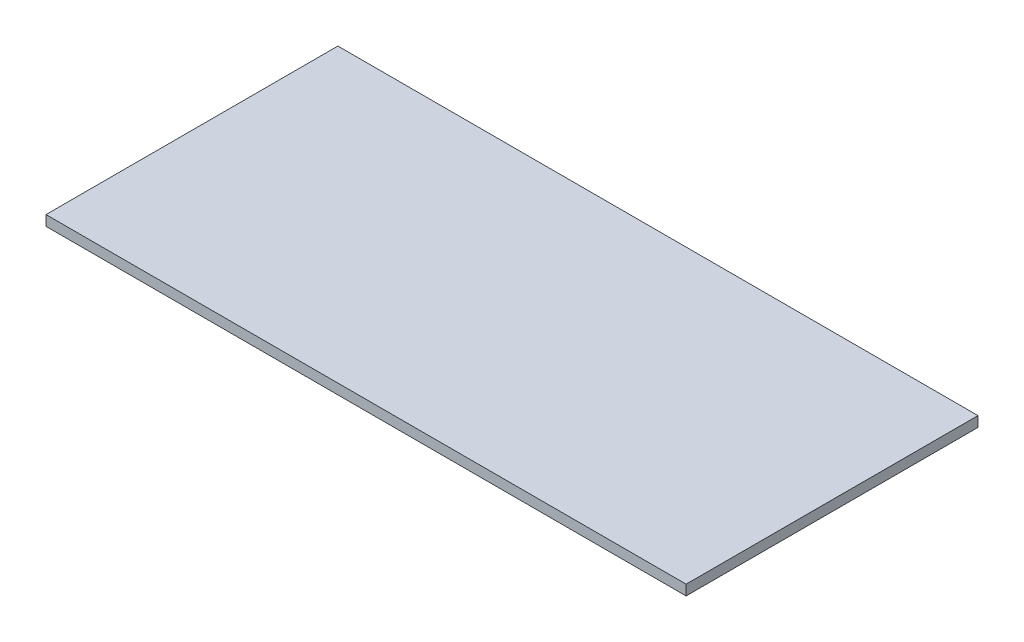
ISO-10303-21;
HEADER;
FILE_DESCRIPTION(('STEP AP214'),'2;1');
FILE_NAME('part.step','',(''),(''),'','','');
FILE_SCHEMA(('AUTOMOTIVE_DESIGN { 1 0 10303 214 1 1 1 1 }'));
ENDSEC;
DATA;
#1=APPLICATION_CONTEXT('core data for automotive mechanical design processes');
#2=APPLICATION_PROTOCOL_DEFINITION('international standard','automotive_design',2000,#1);
#3=PRODUCT_CONTEXT('',#1,'mechanical');
#4=PRODUCT('Part','Part','',(#3));
#5=PRODUCT_RELATED_PRODUCT_CATEGORY('part','',(#4));
#6=PRODUCT_DEFINITION_FORMATION('','',#4);
#7=PRODUCT_DEFINITION_CONTEXT('part definition',#1,'design');
#8=PRODUCT_DEFINITION('design','',#6,#7);
#9=PRODUCT_DEFINITION_SHAPE('','',#8);
#10=(LENGTH_UNIT() NAMED_UNIT(*) SI_UNIT(.MILLI.,.METRE.));
#11=(NAMED_UNIT(*) PLANE_ANGLE_UNIT() SI_UNIT($,.RADIAN.));
#12=(NAMED_UNIT(*) SI_UNIT($,.STERADIAN.) SOLID_ANGLE_UNIT());
#13=UNCERTAINTY_MEASURE_WITH_UNIT(LENGTH_MEASURE(1.E-05),#10,'distance_accuracy_value','');
#14=(GEOMETRIC_REPRESENTATION_CONTEXT(3) GLOBAL_UNCERTAINTY_ASSIGNED_CONTEXT((#13)) GLOBAL_UNIT_ASSIGNED_CONTEXT((#10,
#11,#12)) REPRESENTATION_CONTEXT('',''));
#15=CARTESIAN_POINT('',(0.,0.,0.));
#16=DIRECTION('',(0.,0.,1.));
#17=DIRECTION('',(1.,0.,0.));
#18=AXIS2_PLACEMENT_3D('',#15,#16,#17);
#19=CARTESIAN_POINT('',(-128.271186440678,4.,-50.7203389830509));
#20=DIRECTION('',(1.,0.,0.));
#21=DIRECTION('',(0.,0.,-1.));
#22=AXIS2_PLACEMENT_3D('',#19,#20,#21);
#23=PLANE('',#22);
#24=DIRECTION('',(0.,0.,1.));
#25=VECTOR('',#24,1.);
#26=CARTESIAN_POINT('',(-128.271186440678,0.,-50.7203389830509));
#27=LINE('',#26,#25);
#28=CARTESIAN_POINT('',(-128.271186440678,0.,-50.7203389830509));
#29=VERTEX_POINT('',#28);
#30=CARTESIAN_POINT('',(-128.271186440678,0.,63.2796610169491));
#31=VERTEX_POINT('',#30);
#32=EDGE_CURVE('E95',#29,#31,#27,.T.);
#33=ORIENTED_EDGE('',*,*,#32,.T.);
#34=DIRECTION('',(0.,-1.,0.));
#35=VECTOR('',#34,1.);
#36=CARTESIAN_POINT('',(-128.271186440678,4.,63.2796610169491));
#37=LINE('',#36,#35);
#38=CARTESIAN_POINT('',(-128.271186440678,4.,63.2796610169491));
#39=VERTEX_POINT('',#38);
#40=EDGE_CURVE('E11',#39,#31,#37,.T.);
#41=ORIENTED_EDGE('',*,*,#40,.F.);
#42=DIRECTION('',(0.,0.,1.));
#43=VECTOR('',#42,1.);
#44=CARTESIAN_POINT('',(-128.271186440678,4.,-50.7203389830509));
#45=LINE('',#44,#43);
#46=CARTESIAN_POINT('',(-128.271186440678,4.,-50.7203389830509));
#47=VERTEX_POINT('',#46);
#48=EDGE_CURVE('E83',#47,#39,#45,.T.);
#49=ORIENTED_EDGE('',*,*,#48,.F.);
#50=DIRECTION('',(0.,-1.,0.));
#51=VECTOR('',#50,1.);
#52=CARTESIAN_POINT('',(-128.271186440678,4.,-50.7203389830509));
#53=LINE('',#52,#51);
#54=EDGE_CURVE('E91',#47,#29,#53,.T.);
#55=ORIENTED_EDGE('',*,*,#54,.T.);
#56=EDGE_LOOP('',(#33,#41,#49,#55));
#57=FACE_BOUND('',#56,.T.);
#58=ADVANCED_FACE('F32',(#57),#23,.F.);
#59=CARTESIAN_POINT('',(-128.271186440678,4.,63.2796610169491));
#60=DIRECTION('',(0.,0.,-1.));
#61=DIRECTION('',(-1.,0.,0.));
#62=AXIS2_PLACEMENT_3D('',#59,#60,#61);
#63=PLANE('',#62);
#64=DIRECTION('',(1.,0.,0.));
#65=VECTOR('',#64,1.);
#66=CARTESIAN_POINT('',(-128.271186440678,0.,63.2796610169491));
#67=LINE('',#66,#65);
#68=CARTESIAN_POINT('',(121.728813559322,0.,63.2796610169491));
#69=VERTEX_POINT('',#68);
#70=EDGE_CURVE('E87',#31,#69,#67,.T.);
#71=ORIENTED_EDGE('',*,*,#70,.T.);
#72=DIRECTION('',(0.,-1.,0.));
#73=VECTOR('',#72,1.);
#74=CARTESIAN_POINT('',(121.728813559322,4.,63.2796610169491));
#75=LINE('',#74,#73);
#76=CARTESIAN_POINT('',(121.728813559322,4.,63.2796610169491));
#77=VERTEX_POINT('',#76);
#78=EDGE_CURVE('E40',#77,#69,#75,.T.);
#79=ORIENTED_EDGE('',*,*,#78,.F.);
#80=DIRECTION('',(1.,0.,0.));
#81=VECTOR('',#80,1.);
#82=CARTESIAN_POINT('',(-128.271186440678,4.,63.2796610169491));
#83=LINE('',#82,#81);
#84=EDGE_CURVE('E78',#39,#77,#83,.T.);
#85=ORIENTED_EDGE('',*,*,#84,.F.);
#86=ORIENTED_EDGE('',*,*,#40,.T.);
#87=EDGE_LOOP('',(#71,#79,#85,#86));
#88=FACE_BOUND('',#87,.T.);
#89=ADVANCED_FACE('F86',(#88),#63,.F.);
#90=CARTESIAN_POINT('',(121.728813559322,4.,-50.7203389830509));
#91=DIRECTION('',(-1.,0.,0.));
#92=DIRECTION('',(0.,0.,1.));
#93=AXIS2_PLACEMENT_3D('',#90,#91,#92);
#94=PLANE('',#93);
#95=DIRECTION('',(0.,0.,-1.));
#96=VECTOR('',#95,1.);
#97=CARTESIAN_POINT('',(121.728813559322,0.,-50.7203389830509));
#98=LINE('',#97,#96);
#99=CARTESIAN_POINT('',(121.728813559322,0.,-50.7203389830509));
#100=VERTEX_POINT('',#99);
#101=EDGE_CURVE('E65',#69,#100,#98,.T.);
#102=ORIENTED_EDGE('',*,*,#101,.T.);
#103=DIRECTION('',(0.,-1.,0.));
#104=VECTOR('',#103,1.);
#105=CARTESIAN_POINT('',(121.728813559322,4.,-50.7203389830509));
#106=LINE('',#105,#104);
#107=CARTESIAN_POINT('',(121.728813559322,4.,-50.7203389830509));
#108=VERTEX_POINT('',#107);
#109=EDGE_CURVE('E88',#108,#100,#106,.T.);
#110=ORIENTED_EDGE('',*,*,#109,.F.);
#111=DIRECTION('',(0.,0.,-1.));
#112=VECTOR('',#111,1.);
#113=CARTESIAN_POINT('',(121.728813559322,4.,-50.7203389830509));
#114=LINE('',#113,#112);
#115=EDGE_CURVE('E81',#77,#108,#114,.T.);
#116=ORIENTED_EDGE('',*,*,#115,.F.);
#117=ORIENTED_EDGE('',*,*,#78,.T.);
#118=EDGE_LOOP('',(#102,#110,#116,#117));
#119=FACE_BOUND('',#118,.T.);
#120=ADVANCED_FACE('F89',(#119),#94,.F.);
#121=CARTESIAN_POINT('',(-128.271186440678,4.,-50.7203389830509));
#122=DIRECTION('',(0.,0.,1.));
#123=DIRECTION('',(1.,0.,0.));
#124=AXIS2_PLACEMENT_3D('',#121,#122,#123);
#125=PLANE('',#124);
#126=DIRECTION('',(-1.,0.,0.));
#127=VECTOR('',#126,1.);
#128=CARTESIAN_POINT('',(-128.271186440678,0.,-50.7203389830509));
#129=LINE('',#128,#127);
#130=EDGE_CURVE('E71',#100,#29,#129,.T.);
#131=ORIENTED_EDGE('',*,*,#130,.T.);
#132=ORIENTED_EDGE('',*,*,#54,.F.);
#133=DIRECTION('',(-1.,0.,0.));
#134=VECTOR('',#133,1.);
#135=CARTESIAN_POINT('',(-128.271186440678,4.,-50.7203389830509));
#136=LINE('',#135,#134);
#137=EDGE_CURVE('E48',#108,#47,#136,.T.);
#138=ORIENTED_EDGE('',*,*,#137,.F.);
#139=ORIENTED_EDGE('',*,*,#109,.T.);
#140=EDGE_LOOP('',(#131,#132,#138,#139));
#141=FACE_BOUND('',#140,.T.);
#142=ADVANCED_FACE('F102',(#141),#125,.F.);
#143=CARTESIAN_POINT('',(0.,4.,0.));
#144=DIRECTION('',(0.,1.,0.));
#145=DIRECTION('',(0.,0.,1.));
#146=AXIS2_PLACEMENT_3D('',#143,#144,#145);
#147=PLANE('',#146);
#148=ORIENTED_EDGE('',*,*,#48,.T.);
#149=ORIENTED_EDGE('',*,*,#84,.T.);
#150=ORIENTED_EDGE('',*,*,#115,.T.);
#151=ORIENTED_EDGE('',*,*,#137,.T.);
#152=EDGE_LOOP('',(#148,#149,#150,#151));
#153=FACE_BOUND('',#152,.T.);
#154=ADVANCED_FACE('F79',(#153),#147,.T.);
#155=CARTESIAN_POINT('',(0.,0.,0.));
#156=DIRECTION('',(0.,1.,0.));
#157=DIRECTION('',(0.,0.,1.));
#158=AXIS2_PLACEMENT_3D('',#155,#156,#157);
#159=PLANE('',#158);
#160=ORIENTED_EDGE('',*,*,#32,.F.);
#161=ORIENTED_EDGE('',*,*,#130,.F.);
#162=ORIENTED_EDGE('',*,*,#101,.F.);
#163=ORIENTED_EDGE('',*,*,#70,.F.);
#164=EDGE_LOOP('',(#160,#161,#162,#163));
#165=FACE_BOUND('',#164,.T.);
#166=ADVANCED_FACE('F105',(#165),#159,.F.);
#167=CLOSED_SHELL('',(#58,#89,#120,#142,#154,#166));
#168=MANIFOLD_SOLID_BREP('B2',#167);
#169=ADVANCED_BREP_SHAPE_REPRESENTATION('',(#18,#168),#14);
#170=SHAPE_DEFINITION_REPRESENTATION(#9,#169);
ENDSEC;
END-ISO-10303-21;
